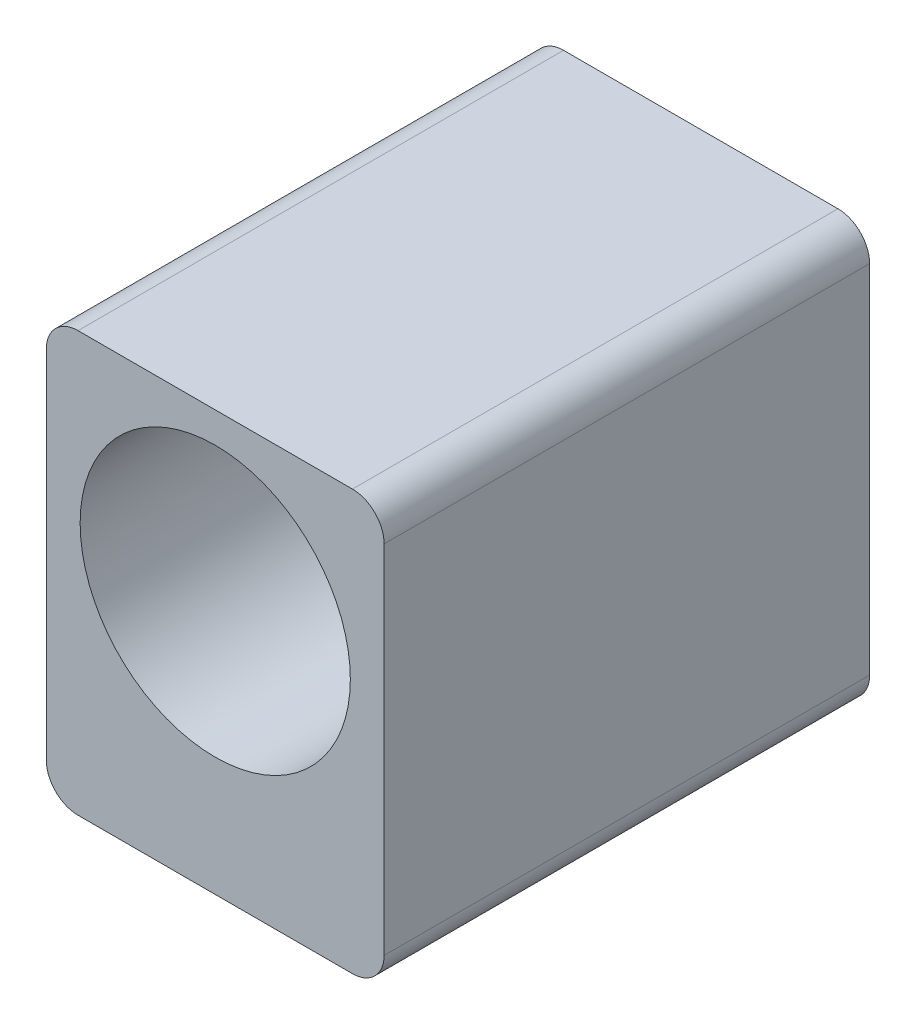
ISO-10303-21;
HEADER;
FILE_DESCRIPTION(('STEP AP214'),'2;1');
FILE_NAME('part.step','',(''),(''),'','','');
FILE_SCHEMA(('AUTOMOTIVE_DESIGN { 1 0 10303 214 1 1 1 1 }'));
ENDSEC;
DATA;
#1=APPLICATION_CONTEXT('core data for automotive mechanical design processes');
#2=APPLICATION_PROTOCOL_DEFINITION('international standard','automotive_design',2000,#1);
#3=PRODUCT_CONTEXT('',#1,'mechanical');
#4=PRODUCT('Part','Part','',(#3));
#5=PRODUCT_RELATED_PRODUCT_CATEGORY('part','',(#4));
#6=PRODUCT_DEFINITION_FORMATION('','',#4);
#7=PRODUCT_DEFINITION_CONTEXT('part definition',#1,'design');
#8=PRODUCT_DEFINITION('design','',#6,#7);
#9=PRODUCT_DEFINITION_SHAPE('','',#8);
#10=(LENGTH_UNIT() NAMED_UNIT(*) SI_UNIT(.MILLI.,.METRE.));
#11=(NAMED_UNIT(*) PLANE_ANGLE_UNIT() SI_UNIT($,.RADIAN.));
#12=(NAMED_UNIT(*) SI_UNIT($,.STERADIAN.) SOLID_ANGLE_UNIT());
#13=UNCERTAINTY_MEASURE_WITH_UNIT(LENGTH_MEASURE(1.E-05),#10,'distance_accuracy_value','');
#14=(GEOMETRIC_REPRESENTATION_CONTEXT(3) GLOBAL_UNCERTAINTY_ASSIGNED_CONTEXT((#13)) GLOBAL_UNIT_ASSIGNED_CONTEXT((#10,
#11,#12)) REPRESENTATION_CONTEXT('',''));
#15=CARTESIAN_POINT('',(0.,0.,0.));
#16=DIRECTION('',(0.,0.,1.));
#17=DIRECTION('',(1.,0.,0.));
#18=AXIS2_PLACEMENT_3D('',#15,#16,#17);
#19=CARTESIAN_POINT('',(-13.,-21.064,23.));
#20=DIRECTION('',(0.,0.,-1.));
#21=DIRECTION('',(-1.,0.,0.));
#22=AXIS2_PLACEMENT_3D('',#19,#20,#21);
#23=CYLINDRICAL_SURFACE('',#22,3.);
#24=CARTESIAN_POINT('',(-13.,-24.064,-15.7679491924311));
#25=CARTESIAN_POINT('',(-13.0476495419929,-24.064003246879,-15.7954566866554));
#26=CARTESIAN_POINT('',(-13.0941261367706,-24.0628644153685,-15.8249157263393));
#27=CARTESIAN_POINT('',(-13.1844127345255,-24.0586667729227,-15.887492356479));
#28=CARTESIAN_POINT('',(-13.2282244852853,-24.0556092356277,-15.9206075079945));
#29=CARTESIAN_POINT('',(-13.354971994891,-24.0441289054113,-16.0248805220334));
#30=CARTESIAN_POINT('',(-13.4335644856848,-24.0333931901029,-16.1011657594107));
#31=CARTESIAN_POINT('',(-13.5768998394832,-24.0089082719283,-16.2649958822506));
#32=CARTESIAN_POINT('',(-13.641668387287,-23.995164755528,-16.3525193936037));
#33=CARTESIAN_POINT('',(-13.7562389302473,-23.967717861115,-16.5369769090204));
#34=CARTESIAN_POINT('',(-13.8060301014096,-23.9540145191842,-16.633917652206));
#35=CARTESIAN_POINT('',(-13.8910629780802,-23.9289728605559,-16.8391498105373));
#36=CARTESIAN_POINT('',(-13.9256094605519,-23.9177573558681,-16.9477463151311));
#37=CARTESIAN_POINT('',(-13.9757945271664,-23.9009950421372,-17.1696173248816));
#38=CARTESIAN_POINT('',(-13.9914448364848,-23.8954447181504,-17.2828888839642));
#39=CARTESIAN_POINT('',(-14.0029639822057,-23.891383235086,-17.5056348392102));
#40=CARTESIAN_POINT('',(-13.999659217434,-23.8925779698607,-17.6150615404273));
#41=CARTESIAN_POINT('',(-13.9753162540335,-23.9010616133414,-17.8316710432726));
#42=CARTESIAN_POINT('',(-13.9542775064692,-23.9083507106914,-17.9388537753359));
#43=CARTESIAN_POINT('',(-13.8958183231178,-23.9272885845804,-18.145934761301));
#44=CARTESIAN_POINT('',(-13.8587245744734,-23.9388497797203,-18.2459341696921));
#45=CARTESIAN_POINT('',(-13.7692513439552,-23.9640696496689,-18.4386401815987));
#46=CARTESIAN_POINT('',(-13.7168589366862,-23.9777300934301,-18.5313405339215));
#47=CARTESIAN_POINT('',(-13.5946245265132,-24.0051843484393,-18.7123427309295));
#48=CARTESIAN_POINT('',(-13.5239601372463,-24.018941628559,-18.8000953033822));
#49=CARTESIAN_POINT('',(-13.3686421667565,-24.0422920015662,-18.9626663833322));
#50=CARTESIAN_POINT('',(-13.2840209392891,-24.0518945433787,-19.0375140040651));
#51=CARTESIAN_POINT('',(-13.162652445956,-24.0597496086829,-19.1278026107539));
#52=CARTESIAN_POINT('',(-13.1309719735022,-24.0613143003361,-19.1499699645611));
#53=CARTESIAN_POINT('',(-13.0663859430122,-24.0634389764101,-19.1924271085756));
#54=CARTESIAN_POINT('',(-13.0334815120283,-24.0639998628735,-19.212718568935));
#55=CARTESIAN_POINT('',(-13.,-24.064,-19.2320508075689));
#56=B_SPLINE_CURVE_WITH_KNOTS('',3,(#24,#25,#26,#27,#28,#29,#30,#31,#32,#33,#34,#35,#36,#37,#38,
#39,#40,#41,#42,#43,#44,#45,#46,#47,#48,#49,#50,#51,#52,#53,#54,#55),.UNSPECIFIED.,.F.,.F.,(4,2,
2,2,2,2,2,2,2,2,2,2,2,2,2,4),(0.,0.164928355044265,0.329747346002017,0.658207068340202,
0.986051097141595,1.31413148930953,1.65592666310572,1.9975096420087,2.32431683994227,
2.65113415419674,2.97159288998393,3.29232315937776,3.63127871423117,3.96945929389357,
4.08549092620192,4.20141823735249),.UNSPECIFIED.);
#57=CARTESIAN_POINT('',(-13.,-24.064,-15.7679491924311));
#58=VERTEX_POINT('',#57);
#59=CARTESIAN_POINT('',(-13.,-24.064,-19.2320508075689));
#60=VERTEX_POINT('',#59);
#61=EDGE_CURVE('E52',#58,#60,#56,.T.);
#62=ORIENTED_EDGE('',*,*,#61,.F.);
#63=DIRECTION('',(0.,0.,-1.));
#64=VECTOR('',#63,1.);
#65=CARTESIAN_POINT('',(-13.,-24.064,23.));
#66=LINE('',#65,#64);
#67=CARTESIAN_POINT('',(-13.,-24.064,23.));
#68=VERTEX_POINT('',#67);
#69=EDGE_CURVE('E116',#68,#58,#66,.T.);
#70=ORIENTED_EDGE('',*,*,#69,.F.);
#71=CARTESIAN_POINT('',(-13.,-21.064,23.));
#72=DIRECTION('',(0.,0.,1.));
#73=DIRECTION('',(1.,0.,0.));
#74=AXIS2_PLACEMENT_3D('',#71,#72,#73);
#75=CIRCLE('',#74,3.);
#76=CARTESIAN_POINT('',(-16.,-21.064,23.));
#77=VERTEX_POINT('',#76);
#78=EDGE_CURVE('E173',#77,#68,#75,.T.);
#79=ORIENTED_EDGE('',*,*,#78,.F.);
#80=DIRECTION('',(0.,0.,-1.));
#81=VECTOR('',#80,1.);
#82=CARTESIAN_POINT('',(-16.,-21.064,23.));
#83=LINE('',#82,#81);
#84=CARTESIAN_POINT('',(-16.,-21.064,-23.));
#85=VERTEX_POINT('',#84);
#86=EDGE_CURVE('E190',#77,#85,#83,.T.);
#87=ORIENTED_EDGE('',*,*,#86,.T.);
#88=CARTESIAN_POINT('',(-13.,-21.064,-23.));
#89=DIRECTION('',(0.,0.,1.));
#90=DIRECTION('',(1.,0.,0.));
#91=AXIS2_PLACEMENT_3D('',#88,#89,#90);
#92=CIRCLE('',#91,3.);
#93=CARTESIAN_POINT('',(-13.,-24.064,-23.));
#94=VERTEX_POINT('',#93);
#95=EDGE_CURVE('E170',#85,#94,#92,.T.);
#96=ORIENTED_EDGE('',*,*,#95,.T.);
#97=EDGE_CURVE('E130',#60,#94,#66,.T.);
#98=ORIENTED_EDGE('',*,*,#97,.F.);
#99=EDGE_LOOP('',(#62,#70,#79,#87,#96,#98));
#100=FACE_BOUND('',#99,.T.);
#101=ADVANCED_FACE('F39',(#100),#23,.T.);
#102=CARTESIAN_POINT('',(13.,-21.064,23.));
#103=DIRECTION('',(0.,0.,-1.));
#104=DIRECTION('',(-1.,0.,0.));
#105=AXIS2_PLACEMENT_3D('',#102,#103,#104);
#106=CYLINDRICAL_SURFACE('',#105,3.);
#107=CARTESIAN_POINT('',(13.,-24.064,15.7679491924311));
#108=CARTESIAN_POINT('',(13.0476495419929,-24.064003246879,15.7954566866554));
#109=CARTESIAN_POINT('',(13.0941261367706,-24.0628644153685,15.8249157263393));
#110=CARTESIAN_POINT('',(13.1844127345255,-24.0586667729227,15.887492356479));
#111=CARTESIAN_POINT('',(13.2282244852853,-24.0556092356277,15.9206075079945));
#112=CARTESIAN_POINT('',(13.354971994891,-24.0441289054113,16.0248805220334));
#113=CARTESIAN_POINT('',(13.4335644856848,-24.0333931901029,16.1011657594107));
#114=CARTESIAN_POINT('',(13.5768998394832,-24.0089082719283,16.2649958822506));
#115=CARTESIAN_POINT('',(13.641668387287,-23.995164755528,16.3525193936037));
#116=CARTESIAN_POINT('',(13.7562389302473,-23.967717861115,16.5369769090204));
#117=CARTESIAN_POINT('',(13.8060301014096,-23.9540145191842,16.633917652206));
#118=CARTESIAN_POINT('',(13.8910629780802,-23.9289728605559,16.8391498105373));
#119=CARTESIAN_POINT('',(13.9256094605519,-23.9177573558681,16.9477463151311));
#120=CARTESIAN_POINT('',(13.9757945271664,-23.9009950421372,17.1696173248816));
#121=CARTESIAN_POINT('',(13.9914448364848,-23.8954447181504,17.2828888839642));
#122=CARTESIAN_POINT('',(14.0029639822057,-23.891383235086,17.5056348392102));
#123=CARTESIAN_POINT('',(13.999659217434,-23.8925779698607,17.6150615404273));
#124=CARTESIAN_POINT('',(13.9753162540335,-23.9010616133414,17.8316710432726));
#125=CARTESIAN_POINT('',(13.9542775064692,-23.9083507106914,17.9388537753359));
#126=CARTESIAN_POINT('',(13.8958183231178,-23.9272885845804,18.145934761301));
#127=CARTESIAN_POINT('',(13.8587245744734,-23.9388497797203,18.2459341696921));
#128=CARTESIAN_POINT('',(13.7692513439552,-23.9640696496689,18.4386401815987));
#129=CARTESIAN_POINT('',(13.7168589366862,-23.9777300934301,18.5313405339215));
#130=CARTESIAN_POINT('',(13.5946245265132,-24.0051843484393,18.7123427309295));
#131=CARTESIAN_POINT('',(13.5239601372463,-24.018941628559,18.8000953033822));
#132=CARTESIAN_POINT('',(13.3686421667565,-24.0422920015662,18.9626663833322));
#133=CARTESIAN_POINT('',(13.2840209392891,-24.0518945433787,19.0375140040651));
#134=CARTESIAN_POINT('',(13.162652445956,-24.0597496086829,19.1278026107539));
#135=CARTESIAN_POINT('',(13.1309719735022,-24.0613143003361,19.1499699645611));
#136=CARTESIAN_POINT('',(13.0663859430122,-24.0634389764101,19.1924271085756));
#137=CARTESIAN_POINT('',(13.0334815120283,-24.0639998628735,19.212718568935));
#138=CARTESIAN_POINT('',(13.,-24.064,19.2320508075689));
#139=B_SPLINE_CURVE_WITH_KNOTS('',3,(#107,#108,#109,#110,#111,#112,#113,#114,#115,#116,#117,
#118,#119,#120,#121,#122,#123,#124,#125,#126,#127,#128,#129,#130,#131,#132,#133,#134,#135,#136,
#137,#138),.UNSPECIFIED.,.F.,.F.,(4,2,2,2,2,2,2,2,2,2,2,2,2,2,2,4),(0.,0.164928355044265,
0.329747346002017,0.658207068340202,0.986051097141595,1.31413148930953,1.65592666310572,
1.9975096420087,2.32431683994227,2.65113415419674,2.97159288998393,3.29232315937776,
3.63127871423117,3.96945929389357,4.08549092620192,4.20141823735249),.UNSPECIFIED.);
#140=CARTESIAN_POINT('',(13.,-24.064,15.7679491924311));
#141=VERTEX_POINT('',#140);
#142=CARTESIAN_POINT('',(13.,-24.064,19.2320508075689));
#143=VERTEX_POINT('',#142);
#144=EDGE_CURVE('E47',#141,#143,#139,.T.);
#145=ORIENTED_EDGE('',*,*,#144,.F.);
#146=DIRECTION('',(0.,0.,-1.));
#147=VECTOR('',#146,1.);
#148=CARTESIAN_POINT('',(13.,-24.064,23.));
#149=LINE('',#148,#147);
#150=CARTESIAN_POINT('',(13.,-24.064,-23.));
#151=VERTEX_POINT('',#150);
#152=EDGE_CURVE('E123',#141,#151,#149,.T.);
#153=ORIENTED_EDGE('',*,*,#152,.T.);
#154=CARTESIAN_POINT('',(13.,-21.064,-23.));
#155=DIRECTION('',(0.,0.,1.));
#156=DIRECTION('',(1.,0.,0.));
#157=AXIS2_PLACEMENT_3D('',#154,#155,#156);
#158=CIRCLE('',#157,3.);
#159=CARTESIAN_POINT('',(16.,-21.064,-23.));
#160=VERTEX_POINT('',#159);
#161=EDGE_CURVE('E195',#151,#160,#158,.T.);
#162=ORIENTED_EDGE('',*,*,#161,.T.);
#163=DIRECTION('',(0.,0.,-1.));
#164=VECTOR('',#163,1.);
#165=CARTESIAN_POINT('',(16.,-21.064,23.));
#166=LINE('',#165,#164);
#167=CARTESIAN_POINT('',(16.,-21.064,23.));
#168=VERTEX_POINT('',#167);
#169=EDGE_CURVE('E133',#168,#160,#166,.T.);
#170=ORIENTED_EDGE('',*,*,#169,.F.);
#171=CARTESIAN_POINT('',(13.,-21.064,23.));
#172=DIRECTION('',(0.,0.,1.));
#173=DIRECTION('',(1.,0.,0.));
#174=AXIS2_PLACEMENT_3D('',#171,#172,#173);
#175=CIRCLE('',#174,3.);
#176=CARTESIAN_POINT('',(13.,-24.064,23.));
#177=VERTEX_POINT('',#176);
#178=EDGE_CURVE('E129',#177,#168,#175,.T.);
#179=ORIENTED_EDGE('',*,*,#178,.F.);
#180=EDGE_CURVE('E120',#177,#143,#149,.T.);
#181=ORIENTED_EDGE('',*,*,#180,.T.);
#182=EDGE_LOOP('',(#145,#153,#162,#170,#179,#181));
#183=FACE_BOUND('',#182,.T.);
#184=ADVANCED_FACE('F127',(#183),#106,.T.);
#185=CARTESIAN_POINT('',(-13.,-21.064,23.));
#186=DIRECTION('',(0.,0.,1.));
#187=DIRECTION('',(1.,0.,0.));
#188=AXIS2_PLACEMENT_3D('',#185,#186,#187);
#189=PLANE('',#188);
#190=ORIENTED_EDGE('',*,*,#78,.T.);
#191=DIRECTION('',(1.,0.,0.));
#192=VECTOR('',#191,1.);
#193=CARTESIAN_POINT('',(-13.,-24.064,23.));
#194=LINE('',#193,#192);
#195=EDGE_CURVE('E176',#68,#177,#194,.T.);
#196=ORIENTED_EDGE('',*,*,#195,.T.);
#197=ORIENTED_EDGE('',*,*,#178,.T.);
#198=DIRECTION('',(0.,1.,0.));
#199=VECTOR('',#198,1.);
#200=CARTESIAN_POINT('',(16.,-21.064,23.));
#201=LINE('',#200,#199);
#202=CARTESIAN_POINT('',(16.,12.7,23.));
#203=VERTEX_POINT('',#202);
#204=EDGE_CURVE('E180',#168,#203,#201,.T.);
#205=ORIENTED_EDGE('',*,*,#204,.T.);
#206=CARTESIAN_POINT('',(13.,12.7,23.));
#207=DIRECTION('',(0.,0.,1.));
#208=DIRECTION('',(1.,0.,0.));
#209=AXIS2_PLACEMENT_3D('',#206,#207,#208);
#210=CIRCLE('',#209,3.);
#211=CARTESIAN_POINT('',(13.,15.7,23.));
#212=VERTEX_POINT('',#211);
#213=EDGE_CURVE('E182',#203,#212,#210,.T.);
#214=ORIENTED_EDGE('',*,*,#213,.T.);
#215=DIRECTION('',(-1.,0.,0.));
#216=VECTOR('',#215,1.);
#217=CARTESIAN_POINT('',(13.,15.7,23.));
#218=LINE('',#217,#216);
#219=CARTESIAN_POINT('',(-13.,15.7,23.));
#220=VERTEX_POINT('',#219);
#221=EDGE_CURVE('E184',#212,#220,#218,.T.);
#222=ORIENTED_EDGE('',*,*,#221,.T.);
#223=CARTESIAN_POINT('',(-13.,12.7,23.));
#224=DIRECTION('',(0.,0.,1.));
#225=DIRECTION('',(1.,0.,0.));
#226=AXIS2_PLACEMENT_3D('',#223,#224,#225);
#227=CIRCLE('',#226,3.);
#228=CARTESIAN_POINT('',(-16.,12.7,23.));
#229=VERTEX_POINT('',#228);
#230=EDGE_CURVE('E186',#220,#229,#227,.T.);
#231=ORIENTED_EDGE('',*,*,#230,.T.);
#232=DIRECTION('',(0.,-1.,0.));
#233=VECTOR('',#232,1.);
#234=CARTESIAN_POINT('',(-16.,12.7,23.));
#235=LINE('',#234,#233);
#236=EDGE_CURVE('E188',#229,#77,#235,.T.);
#237=ORIENTED_EDGE('',*,*,#236,.T.);
#238=EDGE_LOOP('',(#190,#196,#197,#205,#214,#222,#231,#237));
#239=FACE_BOUND('',#238,.T.);
#240=CARTESIAN_POINT('',(0.,0.,23.));
#241=DIRECTION('',(0.,0.,1.));
#242=DIRECTION('',(1.,0.,0.));
#243=AXIS2_PLACEMENT_3D('',#240,#241,#242);
#244=CIRCLE('',#243,12.8);
#245=CARTESIAN_POINT('',(12.8,0.,23.));
#246=VERTEX_POINT('',#245);
#247=EDGE_CURVE('E167',#246,#246,#244,.T.);
#248=ORIENTED_EDGE('',*,*,#247,.F.);
#249=EDGE_LOOP('',(#248));
#250=FACE_BOUND('',#249,.T.);
#251=ADVANCED_FACE('F243',(#239,#250),#189,.T.);
#252=CARTESIAN_POINT('',(-13.,-21.064,-23.));
#253=DIRECTION('',(0.,0.,1.));
#254=DIRECTION('',(1.,0.,0.));
#255=AXIS2_PLACEMENT_3D('',#252,#253,#254);
#256=PLANE('',#255);
#257=ORIENTED_EDGE('',*,*,#95,.F.);
#258=DIRECTION('',(0.,-1.,0.));
#259=VECTOR('',#258,1.);
#260=CARTESIAN_POINT('',(-16.,12.7,-23.));
#261=LINE('',#260,#259);
#262=CARTESIAN_POINT('',(-16.,12.7,-23.));
#263=VERTEX_POINT('',#262);
#264=EDGE_CURVE('E177',#263,#85,#261,.T.);
#265=ORIENTED_EDGE('',*,*,#264,.F.);
#266=CARTESIAN_POINT('',(-13.,12.7,-23.));
#267=DIRECTION('',(0.,0.,1.));
#268=DIRECTION('',(1.,0.,0.));
#269=AXIS2_PLACEMENT_3D('',#266,#267,#268);
#270=CIRCLE('',#269,3.);
#271=CARTESIAN_POINT('',(-13.,15.7,-23.));
#272=VERTEX_POINT('',#271);
#273=EDGE_CURVE('E203',#272,#263,#270,.T.);
#274=ORIENTED_EDGE('',*,*,#273,.F.);
#275=DIRECTION('',(-1.,0.,0.));
#276=VECTOR('',#275,1.);
#277=CARTESIAN_POINT('',(13.,15.7,-23.));
#278=LINE('',#277,#276);
#279=CARTESIAN_POINT('',(13.,15.7,-23.));
#280=VERTEX_POINT('',#279);
#281=EDGE_CURVE('E201',#280,#272,#278,.T.);
#282=ORIENTED_EDGE('',*,*,#281,.F.);
#283=CARTESIAN_POINT('',(13.,12.7,-23.));
#284=DIRECTION('',(0.,0.,1.));
#285=DIRECTION('',(1.,0.,0.));
#286=AXIS2_PLACEMENT_3D('',#283,#284,#285);
#287=CIRCLE('',#286,3.);
#288=CARTESIAN_POINT('',(16.,12.7,-23.));
#289=VERTEX_POINT('',#288);
#290=EDGE_CURVE('E199',#289,#280,#287,.T.);
#291=ORIENTED_EDGE('',*,*,#290,.F.);
#292=DIRECTION('',(0.,1.,0.));
#293=VECTOR('',#292,1.);
#294=CARTESIAN_POINT('',(16.,-21.064,-23.));
#295=LINE('',#294,#293);
#296=EDGE_CURVE('E197',#160,#289,#295,.T.);
#297=ORIENTED_EDGE('',*,*,#296,.F.);
#298=ORIENTED_EDGE('',*,*,#161,.F.);
#299=DIRECTION('',(1.,0.,0.));
#300=VECTOR('',#299,1.);
#301=CARTESIAN_POINT('',(-13.,-24.064,-23.));
#302=LINE('',#301,#300);
#303=EDGE_CURVE('E193',#94,#151,#302,.T.);
#304=ORIENTED_EDGE('',*,*,#303,.F.);
#305=EDGE_LOOP('',(#257,#265,#274,#282,#291,#297,#298,#304));
#306=FACE_BOUND('',#305,.T.);
#307=CARTESIAN_POINT('',(0.,0.,-23.));
#308=DIRECTION('',(0.,0.,1.));
#309=DIRECTION('',(1.,0.,0.));
#310=AXIS2_PLACEMENT_3D('',#307,#308,#309);
#311=CIRCLE('',#310,12.8);
#312=CARTESIAN_POINT('',(12.8,0.,-23.));
#313=VERTEX_POINT('',#312);
#314=EDGE_CURVE('E166',#313,#313,#311,.T.);
#315=ORIENTED_EDGE('',*,*,#314,.T.);
#316=EDGE_LOOP('',(#315));
#317=FACE_BOUND('',#316,.T.);
#318=ADVANCED_FACE('F230',(#306,#317),#256,.F.);
#319=CARTESIAN_POINT('',(-13.,-24.064,23.));
#320=DIRECTION('',(0.,1.,0.));
#321=DIRECTION('',(0.,0.,1.));
#322=AXIS2_PLACEMENT_3D('',#319,#320,#321);
#323=PLANE('',#322);
#324=CARTESIAN_POINT('',(12.,-24.064,17.5));
#325=DIRECTION('',(0.,1.,0.));
#326=DIRECTION('',(0.,0.,1.));
#327=AXIS2_PLACEMENT_3D('',#324,#325,#326);
#328=CIRCLE('',#327,2.);
#329=EDGE_CURVE('E59',#141,#143,#328,.T.);
#330=ORIENTED_EDGE('',*,*,#329,.T.);
#331=ORIENTED_EDGE('',*,*,#180,.F.);
#332=ORIENTED_EDGE('',*,*,#195,.F.);
#333=ORIENTED_EDGE('',*,*,#69,.T.);
#334=CARTESIAN_POINT('',(-12.,-24.064,-17.5));
#335=DIRECTION('',(0.,1.,0.));
#336=DIRECTION('',(0.,0.,1.));
#337=AXIS2_PLACEMENT_3D('',#334,#335,#336);
#338=CIRCLE('',#337,2.);
#339=EDGE_CURVE('E11',#60,#58,#338,.F.);
#340=ORIENTED_EDGE('',*,*,#339,.F.);
#341=ORIENTED_EDGE('',*,*,#97,.T.);
#342=ORIENTED_EDGE('',*,*,#303,.T.);
#343=ORIENTED_EDGE('',*,*,#152,.F.);
#344=EDGE_LOOP('',(#330,#331,#332,#333,#340,#341,#342,#343));
#345=FACE_BOUND('',#344,.T.);
#346=ADVANCED_FACE('F119',(#345),#323,.F.);
#347=CARTESIAN_POINT('',(16.,-21.064,23.));
#348=DIRECTION('',(-1.,0.,0.));
#349=DIRECTION('',(0.,0.,1.));
#350=AXIS2_PLACEMENT_3D('',#347,#348,#349);
#351=PLANE('',#350);
#352=ORIENTED_EDGE('',*,*,#296,.T.);
#353=DIRECTION('',(0.,0.,-1.));
#354=VECTOR('',#353,1.);
#355=CARTESIAN_POINT('',(16.,12.7,23.));
#356=LINE('',#355,#354);
#357=EDGE_CURVE('E216',#203,#289,#356,.T.);
#358=ORIENTED_EDGE('',*,*,#357,.F.);
#359=ORIENTED_EDGE('',*,*,#204,.F.);
#360=ORIENTED_EDGE('',*,*,#169,.T.);
#361=EDGE_LOOP('',(#352,#358,#359,#360));
#362=FACE_BOUND('',#361,.T.);
#363=ADVANCED_FACE('F226',(#362),#351,.F.);
#364=CARTESIAN_POINT('',(13.,12.7,23.));
#365=DIRECTION('',(0.,0.,-1.));
#366=DIRECTION('',(-1.,0.,0.));
#367=AXIS2_PLACEMENT_3D('',#364,#365,#366);
#368=CYLINDRICAL_SURFACE('',#367,3.);
#369=ORIENTED_EDGE('',*,*,#290,.T.);
#370=DIRECTION('',(0.,0.,-1.));
#371=VECTOR('',#370,1.);
#372=CARTESIAN_POINT('',(13.,15.7,23.));
#373=LINE('',#372,#371);
#374=EDGE_CURVE('E214',#212,#280,#373,.T.);
#375=ORIENTED_EDGE('',*,*,#374,.F.);
#376=ORIENTED_EDGE('',*,*,#213,.F.);
#377=ORIENTED_EDGE('',*,*,#357,.T.);
#378=EDGE_LOOP('',(#369,#375,#376,#377));
#379=FACE_BOUND('',#378,.T.);
#380=ADVANCED_FACE('F236',(#379),#368,.T.);
#381=CARTESIAN_POINT('',(13.,15.7,23.));
#382=DIRECTION('',(0.,-1.,0.));
#383=DIRECTION('',(0.,0.,-1.));
#384=AXIS2_PLACEMENT_3D('',#381,#382,#383);
#385=PLANE('',#384);
#386=ORIENTED_EDGE('',*,*,#281,.T.);
#387=DIRECTION('',(0.,0.,-1.));
#388=VECTOR('',#387,1.);
#389=CARTESIAN_POINT('',(-13.,15.7,23.));
#390=LINE('',#389,#388);
#391=EDGE_CURVE('E211',#220,#272,#390,.T.);
#392=ORIENTED_EDGE('',*,*,#391,.F.);
#393=ORIENTED_EDGE('',*,*,#221,.F.);
#394=ORIENTED_EDGE('',*,*,#374,.T.);
#395=EDGE_LOOP('',(#386,#392,#393,#394));
#396=FACE_BOUND('',#395,.T.);
#397=ADVANCED_FACE('F239',(#396),#385,.F.);
#398=CARTESIAN_POINT('',(-13.,12.7,23.));
#399=DIRECTION('',(0.,0.,-1.));
#400=DIRECTION('',(-1.,0.,0.));
#401=AXIS2_PLACEMENT_3D('',#398,#399,#400);
#402=CYLINDRICAL_SURFACE('',#401,3.);
#403=ORIENTED_EDGE('',*,*,#273,.T.);
#404=DIRECTION('',(0.,0.,-1.));
#405=VECTOR('',#404,1.);
#406=CARTESIAN_POINT('',(-16.,12.7,23.));
#407=LINE('',#406,#405);
#408=EDGE_CURVE('E208',#229,#263,#407,.T.);
#409=ORIENTED_EDGE('',*,*,#408,.F.);
#410=ORIENTED_EDGE('',*,*,#230,.F.);
#411=ORIENTED_EDGE('',*,*,#391,.T.);
#412=EDGE_LOOP('',(#403,#409,#410,#411));
#413=FACE_BOUND('',#412,.T.);
#414=ADVANCED_FACE('F256',(#413),#402,.T.);
#415=CARTESIAN_POINT('',(-16.,12.7,23.));
#416=DIRECTION('',(1.,0.,0.));
#417=DIRECTION('',(0.,0.,-1.));
#418=AXIS2_PLACEMENT_3D('',#415,#416,#417);
#419=PLANE('',#418);
#420=ORIENTED_EDGE('',*,*,#264,.T.);
#421=ORIENTED_EDGE('',*,*,#86,.F.);
#422=ORIENTED_EDGE('',*,*,#236,.F.);
#423=ORIENTED_EDGE('',*,*,#408,.T.);
#424=EDGE_LOOP('',(#420,#421,#422,#423));
#425=FACE_BOUND('',#424,.T.);
#426=ADVANCED_FACE('F253',(#425),#419,.F.);
#427=CARTESIAN_POINT('',(0.,0.,23.));
#428=DIRECTION('',(0.,0.,-1.));
#429=DIRECTION('',(-1.,0.,0.));
#430=AXIS2_PLACEMENT_3D('',#427,#428,#429);
#431=CYLINDRICAL_SURFACE('',#430,12.8);
#432=ORIENTED_EDGE('',*,*,#247,.T.);
#433=EDGE_LOOP('',(#432));
#434=FACE_BOUND('',#433,.T.);
#435=ORIENTED_EDGE('',*,*,#314,.F.);
#436=EDGE_LOOP('',(#435));
#437=FACE_BOUND('',#436,.T.);
#438=ADVANCED_FACE('F150',(#434,#437),#431,.F.);
#439=CARTESIAN_POINT('',(12.,-15.064,17.5));
#440=DIRECTION('',(0.,-1.,0.));
#441=DIRECTION('',(0.,0.,-1.));
#442=AXIS2_PLACEMENT_3D('',#439,#440,#441);
#443=CYLINDRICAL_SURFACE('',#442,2.);
#444=CARTESIAN_POINT('',(12.,-15.064,17.5));
#445=DIRECTION('',(0.,1.,0.));
#446=DIRECTION('',(0.,0.,1.));
#447=AXIS2_PLACEMENT_3D('',#444,#445,#446);
#448=CIRCLE('',#447,2.);
#449=CARTESIAN_POINT('',(12.,-15.064,19.5));
#450=VERTEX_POINT('',#449);
#451=EDGE_CURVE('E124',#450,#450,#448,.T.);
#452=ORIENTED_EDGE('',*,*,#451,.T.);
#453=EDGE_LOOP('',(#452));
#454=FACE_BOUND('',#453,.T.);
#455=ORIENTED_EDGE('',*,*,#144,.T.);
#456=ORIENTED_EDGE('',*,*,#329,.F.);
#457=EDGE_LOOP('',(#455,#456));
#458=FACE_BOUND('',#457,.T.);
#459=ADVANCED_FACE('F112',(#454,#458),#443,.F.);
#460=CARTESIAN_POINT('',(12.,-15.064,17.5));
#461=DIRECTION('',(0.,1.,0.));
#462=DIRECTION('',(0.,0.,1.));
#463=AXIS2_PLACEMENT_3D('',#460,#461,#462);
#464=PLANE('',#463);
#465=ORIENTED_EDGE('',*,*,#451,.F.);
#466=EDGE_LOOP('',(#465));
#467=FACE_BOUND('',#466,.T.);
#468=ADVANCED_FACE('F149',(#467),#464,.F.);
#469=CARTESIAN_POINT('',(-12.,-15.064,-17.5));
#470=DIRECTION('',(0.,-1.,0.));
#471=DIRECTION('',(0.,0.,-1.));
#472=AXIS2_PLACEMENT_3D('',#469,#470,#471);
#473=CYLINDRICAL_SURFACE('',#472,2.);
#474=CARTESIAN_POINT('',(-12.,-15.064,-17.5));
#475=DIRECTION('',(0.,1.,0.));
#476=DIRECTION('',(0.,0.,1.));
#477=AXIS2_PLACEMENT_3D('',#474,#475,#476);
#478=CIRCLE('',#477,2.);
#479=CARTESIAN_POINT('',(-12.,-15.064,-15.5));
#480=VERTEX_POINT('',#479);
#481=EDGE_CURVE('E125',#480,#480,#478,.T.);
#482=ORIENTED_EDGE('',*,*,#481,.T.);
#483=EDGE_LOOP('',(#482));
#484=FACE_BOUND('',#483,.T.);
#485=ORIENTED_EDGE('',*,*,#61,.T.);
#486=ORIENTED_EDGE('',*,*,#339,.T.);
#487=EDGE_LOOP('',(#485,#486));
#488=FACE_BOUND('',#487,.T.);
#489=ADVANCED_FACE('F152',(#484,#488),#473,.F.);
#490=CARTESIAN_POINT('',(-12.,-15.064,-17.5));
#491=DIRECTION('',(0.,1.,0.));
#492=DIRECTION('',(0.,0.,1.));
#493=AXIS2_PLACEMENT_3D('',#490,#491,#492);
#494=PLANE('',#493);
#495=ORIENTED_EDGE('',*,*,#481,.F.);
#496=EDGE_LOOP('',(#495));
#497=FACE_BOUND('',#496,.T.);
#498=ADVANCED_FACE('F156',(#497),#494,.F.);
#499=CLOSED_SHELL('',(#101,#184,#251,#318,#346,#363,#380,#397,#414,#426,#438,#459,#468,#489,#498));
#500=MANIFOLD_SOLID_BREP('B2',#499);
#501=ADVANCED_BREP_SHAPE_REPRESENTATION('',(#18,#500),#14);
#502=SHAPE_DEFINITION_REPRESENTATION(#9,#501);
ENDSEC;
END-ISO-10303-21;
